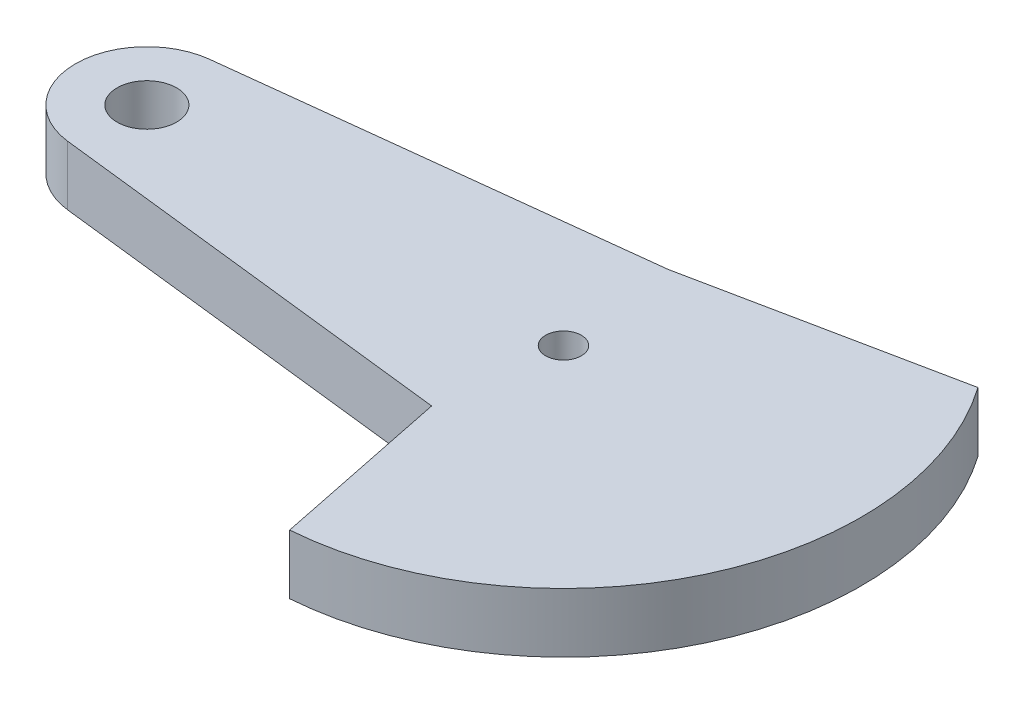
ISO-10303-21;
HEADER;
FILE_DESCRIPTION(('STEP AP214'),'2;1');
FILE_NAME('part.step','',(''),(''),'','','');
FILE_SCHEMA(('AUTOMOTIVE_DESIGN { 1 0 10303 214 1 1 1 1 }'));
ENDSEC;
DATA;
#1=APPLICATION_CONTEXT('core data for automotive mechanical design processes');
#2=APPLICATION_PROTOCOL_DEFINITION('international standard','automotive_design',2000,#1);
#3=PRODUCT_CONTEXT('',#1,'mechanical');
#4=PRODUCT('Part','Part','',(#3));
#5=PRODUCT_RELATED_PRODUCT_CATEGORY('part','',(#4));
#6=PRODUCT_DEFINITION_FORMATION('','',#4);
#7=PRODUCT_DEFINITION_CONTEXT('part definition',#1,'design');
#8=PRODUCT_DEFINITION('design','',#6,#7);
#9=PRODUCT_DEFINITION_SHAPE('','',#8);
#10=(LENGTH_UNIT() NAMED_UNIT(*) SI_UNIT(.MILLI.,.METRE.));
#11=(NAMED_UNIT(*) PLANE_ANGLE_UNIT() SI_UNIT($,.RADIAN.));
#12=(NAMED_UNIT(*) SI_UNIT($,.STERADIAN.) SOLID_ANGLE_UNIT());
#13=UNCERTAINTY_MEASURE_WITH_UNIT(LENGTH_MEASURE(1.E-05),#10,'distance_accuracy_value','');
#14=(GEOMETRIC_REPRESENTATION_CONTEXT(3) GLOBAL_UNCERTAINTY_ASSIGNED_CONTEXT((#13)) GLOBAL_UNIT_ASSIGNED_CONTEXT((#10,
#11,#12)) REPRESENTATION_CONTEXT('',''));
#15=CARTESIAN_POINT('',(0.,0.,0.));
#16=DIRECTION('',(0.,0.,1.));
#17=DIRECTION('',(1.,0.,0.));
#18=AXIS2_PLACEMENT_3D('',#15,#16,#17);
#19=CARTESIAN_POINT('',(10.,-43.8,-9.99999999999999));
#20=DIRECTION('',(0.,-1.,0.));
#21=DIRECTION('',(0.,0.,-1.));
#22=AXIS2_PLACEMENT_3D('',#19,#20,#21);
#23=PLANE('',#22);
#24=CARTESIAN_POINT('',(10.,-43.8,-9.99999999999999));
#25=DIRECTION('',(0.,-1.,0.));
#26=DIRECTION('',(0.,0.,-1.));
#27=AXIS2_PLACEMENT_3D('',#24,#25,#26);
#28=CIRCLE('',#27,1.5);
#29=CARTESIAN_POINT('',(10.,-43.8,-11.5));
#30=VERTEX_POINT('',#29);
#31=EDGE_CURVE('E124',#30,#30,#28,.T.);
#32=ORIENTED_EDGE('',*,*,#31,.F.);
#33=EDGE_LOOP('',(#32));
#34=FACE_BOUND('',#33,.T.);
#35=DIRECTION('',(-0.200435514240337,0.,-0.979706897307155));
#36=VECTOR('',#35,1.);
#37=CARTESIAN_POINT('',(8.85714285714286,-43.8,-0.0655207710207571));
#38=LINE('',#37,#36);
#39=CARTESIAN_POINT('',(11.9241838076419,-43.8,14.9258403403859));
#40=VERTEX_POINT('',#39);
#41=CARTESIAN_POINT('',(8.85714285714286,-43.8,-0.0655207710207571));
#42=VERTEX_POINT('',#41);
#43=EDGE_CURVE('E131',#40,#42,#38,.T.);
#44=ORIENTED_EDGE('',*,*,#43,.T.);
#45=DIRECTION('',(-0.993447922897926,0.,-0.114285714285714));
#46=VECTOR('',#45,1.);
#47=CARTESIAN_POINT('',(8.85714285714286,-43.8,-0.0655207710207571));
#48=LINE('',#47,#46);
#49=CARTESIAN_POINT('',(-25.6857142857142,-43.8,-4.03931246261245));
#50=VERTEX_POINT('',#49);
#51=EDGE_CURVE('E89',#42,#50,#48,.T.);
#52=ORIENTED_EDGE('',*,*,#51,.T.);
#53=CARTESIAN_POINT('',(-24.9999999999999,-43.8,-10.));
#54=DIRECTION('',(0.,-1.,0.));
#55=DIRECTION('',(0.,0.,-1.));
#56=AXIS2_PLACEMENT_3D('',#53,#54,#55);
#57=CIRCLE('',#56,6.);
#58=CARTESIAN_POINT('',(-25.6857142857142,-43.8,-15.9606875373876));
#59=VERTEX_POINT('',#58);
#60=EDGE_CURVE('E102',#50,#59,#57,.T.);
#61=ORIENTED_EDGE('',*,*,#60,.T.);
#62=DIRECTION('',(0.993447922897926,0.,-0.114285714285715));
#63=VECTOR('',#62,1.);
#64=CARTESIAN_POINT('',(-25.6857142857142,-43.8,-15.9606875373876));
#65=LINE('',#64,#63);
#66=CARTESIAN_POINT('',(8.85714285714286,-43.8,-19.9344792289793));
#67=VERTEX_POINT('',#66);
#68=EDGE_CURVE('E96',#59,#67,#65,.T.);
#69=ORIENTED_EDGE('',*,*,#68,.T.);
#70=DIRECTION('',(0.979706897307154,0.,-0.200435514240341));
#71=VECTOR('',#70,1.);
#72=CARTESIAN_POINT('',(8.85714285714286,-43.8,-19.9344792289793));
#73=LINE('',#72,#71);
#74=CARTESIAN_POINT('',(30.4674109628781,-43.8,-24.3556639859206));
#75=VERTEX_POINT('',#74);
#76=EDGE_CURVE('E100',#67,#75,#73,.T.);
#77=ORIENTED_EDGE('',*,*,#76,.T.);
#78=CARTESIAN_POINT('',(10.,-43.8,-9.99999999999999));
#79=DIRECTION('',(0.,-1.,0.));
#80=DIRECTION('',(0.,0.,-1.));
#81=AXIS2_PLACEMENT_3D('',#78,#79,#80);
#82=CIRCLE('',#81,25.);
#83=EDGE_CURVE('E52',#75,#40,#82,.T.);
#84=ORIENTED_EDGE('',*,*,#83,.T.);
#85=EDGE_LOOP('',(#44,#52,#61,#69,#77,#84));
#86=FACE_BOUND('',#85,.T.);
#87=CARTESIAN_POINT('',(-24.9999999999999,-43.8,-10.));
#88=DIRECTION('',(0.,-1.,0.));
#89=DIRECTION('',(0.,0.,-1.));
#90=AXIS2_PLACEMENT_3D('',#87,#88,#89);
#91=CIRCLE('',#90,2.5);
#92=CARTESIAN_POINT('',(-24.9999999999999,-43.8,-12.5));
#93=VERTEX_POINT('',#92);
#94=EDGE_CURVE('E173',#93,#93,#91,.T.);
#95=ORIENTED_EDGE('',*,*,#94,.F.);
#96=EDGE_LOOP('',(#95));
#97=FACE_BOUND('',#96,.T.);
#98=ADVANCED_FACE('F35',(#34,#86,#97),#23,.T.);
#99=CARTESIAN_POINT('',(10.,-38.8,-9.99999999999999));
#100=DIRECTION('',(0.,-1.,0.));
#101=DIRECTION('',(0.,0.,-1.));
#102=AXIS2_PLACEMENT_3D('',#99,#100,#101);
#103=PLANE('',#102);
#104=DIRECTION('',(-0.200435514240337,0.,-0.979706897307155));
#105=VECTOR('',#104,1.);
#106=CARTESIAN_POINT('',(8.85714285714286,-38.8,-0.0655207710207571));
#107=LINE('',#106,#105);
#108=CARTESIAN_POINT('',(11.9241838076419,-38.8,14.9258403403859));
#109=VERTEX_POINT('',#108);
#110=CARTESIAN_POINT('',(8.85714285714286,-38.8,-0.0655207710207571));
#111=VERTEX_POINT('',#110);
#112=EDGE_CURVE('E120',#109,#111,#107,.T.);
#113=ORIENTED_EDGE('',*,*,#112,.F.);
#114=CARTESIAN_POINT('',(10.,-38.8,-9.99999999999999));
#115=DIRECTION('',(0.,-1.,0.));
#116=DIRECTION('',(0.,0.,-1.));
#117=AXIS2_PLACEMENT_3D('',#114,#115,#116);
#118=CIRCLE('',#117,25.);
#119=CARTESIAN_POINT('',(30.4674109628781,-38.8,-24.3556639859206));
#120=VERTEX_POINT('',#119);
#121=EDGE_CURVE('E81',#120,#109,#118,.T.);
#122=ORIENTED_EDGE('',*,*,#121,.F.);
#123=DIRECTION('',(0.979706897307154,0.,-0.200435514240341));
#124=VECTOR('',#123,1.);
#125=CARTESIAN_POINT('',(8.85714285714286,-38.8,-19.9344792289793));
#126=LINE('',#125,#124);
#127=CARTESIAN_POINT('',(8.85714285714286,-38.8,-19.9344792289793));
#128=VERTEX_POINT('',#127);
#129=EDGE_CURVE('E75',#128,#120,#126,.T.);
#130=ORIENTED_EDGE('',*,*,#129,.F.);
#131=DIRECTION('',(0.993447922897926,0.,-0.114285714285715));
#132=VECTOR('',#131,1.);
#133=CARTESIAN_POINT('',(-25.6857142857142,-38.8,-15.9606875373876));
#134=LINE('',#133,#132);
#135=CARTESIAN_POINT('',(-25.6857142857142,-38.8,-15.9606875373876));
#136=VERTEX_POINT('',#135);
#137=EDGE_CURVE('E110',#136,#128,#134,.T.);
#138=ORIENTED_EDGE('',*,*,#137,.F.);
#139=CARTESIAN_POINT('',(-24.9999999999999,-38.8,-10.));
#140=DIRECTION('',(0.,-1.,0.));
#141=DIRECTION('',(0.,0.,-1.));
#142=AXIS2_PLACEMENT_3D('',#139,#140,#141);
#143=CIRCLE('',#142,6.);
#144=CARTESIAN_POINT('',(-25.6857142857142,-38.8,-4.03931246261245));
#145=VERTEX_POINT('',#144);
#146=EDGE_CURVE('E126',#145,#136,#143,.T.);
#147=ORIENTED_EDGE('',*,*,#146,.F.);
#148=DIRECTION('',(-0.993447922897926,0.,-0.114285714285714));
#149=VECTOR('',#148,1.);
#150=CARTESIAN_POINT('',(8.85714285714286,-38.8,-0.0655207710207571));
#151=LINE('',#150,#149);
#152=EDGE_CURVE('E123',#111,#145,#151,.T.);
#153=ORIENTED_EDGE('',*,*,#152,.F.);
#154=EDGE_LOOP('',(#113,#122,#130,#138,#147,#153));
#155=FACE_BOUND('',#154,.T.);
#156=CARTESIAN_POINT('',(10.,-38.8,-9.99999999999999));
#157=DIRECTION('',(0.,-1.,0.));
#158=DIRECTION('',(0.,0.,-1.));
#159=AXIS2_PLACEMENT_3D('',#156,#157,#158);
#160=CIRCLE('',#159,1.5);
#161=CARTESIAN_POINT('',(10.,-38.8,-11.5));
#162=VERTEX_POINT('',#161);
#163=EDGE_CURVE('E179',#162,#162,#160,.T.);
#164=ORIENTED_EDGE('',*,*,#163,.T.);
#165=EDGE_LOOP('',(#164));
#166=FACE_BOUND('',#165,.T.);
#167=CARTESIAN_POINT('',(-24.9999999999999,-38.8,-10.));
#168=DIRECTION('',(0.,-1.,0.));
#169=DIRECTION('',(0.,0.,-1.));
#170=AXIS2_PLACEMENT_3D('',#167,#168,#169);
#171=CIRCLE('',#170,2.5);
#172=CARTESIAN_POINT('',(-24.9999999999999,-38.8,-12.5));
#173=VERTEX_POINT('',#172);
#174=EDGE_CURVE('E176',#173,#173,#171,.T.);
#175=ORIENTED_EDGE('',*,*,#174,.T.);
#176=EDGE_LOOP('',(#175));
#177=FACE_BOUND('',#176,.T.);
#178=ADVANCED_FACE('F140',(#155,#166,#177),#103,.F.);
#179=CARTESIAN_POINT('',(8.85714285714286,-43.8,-0.0655207710207571));
#180=DIRECTION('',(0.979706897307155,0.,-0.200435514240337));
#181=DIRECTION('',(-0.200435514240337,0.,-0.979706897307155));
#182=AXIS2_PLACEMENT_3D('',#179,#180,#181);
#183=PLANE('',#182);
#184=ORIENTED_EDGE('',*,*,#112,.T.);
#185=DIRECTION('',(0.,1.,0.));
#186=VECTOR('',#185,1.);
#187=CARTESIAN_POINT('',(8.85714285714286,-43.8,-0.0655207710207571));
#188=LINE('',#187,#186);
#189=EDGE_CURVE('E11',#42,#111,#188,.T.);
#190=ORIENTED_EDGE('',*,*,#189,.F.);
#191=ORIENTED_EDGE('',*,*,#43,.F.);
#192=DIRECTION('',(0.,1.,0.));
#193=VECTOR('',#192,1.);
#194=CARTESIAN_POINT('',(11.9241838076419,-43.8,14.9258403403859));
#195=LINE('',#194,#193);
#196=EDGE_CURVE('E116',#40,#109,#195,.T.);
#197=ORIENTED_EDGE('',*,*,#196,.T.);
#198=EDGE_LOOP('',(#184,#190,#191,#197));
#199=FACE_BOUND('',#198,.T.);
#200=ADVANCED_FACE('F37',(#199),#183,.F.);
#201=CARTESIAN_POINT('',(8.85714285714286,-43.8,-0.0655207710207571));
#202=DIRECTION('',(0.114285714285714,0.,-0.993447922897926));
#203=DIRECTION('',(-0.993447922897926,0.,-0.114285714285714));
#204=AXIS2_PLACEMENT_3D('',#201,#202,#203);
#205=PLANE('',#204);
#206=ORIENTED_EDGE('',*,*,#152,.T.);
#207=DIRECTION('',(0.,1.,0.));
#208=VECTOR('',#207,1.);
#209=CARTESIAN_POINT('',(-25.6857142857142,-43.8,-4.03931246261245));
#210=LINE('',#209,#208);
#211=EDGE_CURVE('E44',#50,#145,#210,.T.);
#212=ORIENTED_EDGE('',*,*,#211,.F.);
#213=ORIENTED_EDGE('',*,*,#51,.F.);
#214=ORIENTED_EDGE('',*,*,#189,.T.);
#215=EDGE_LOOP('',(#206,#212,#213,#214));
#216=FACE_BOUND('',#215,.T.);
#217=ADVANCED_FACE('F220',(#216),#205,.F.);
#218=CARTESIAN_POINT('',(-24.9999999999999,-43.8,-10.));
#219=DIRECTION('',(0.,1.,0.));
#220=DIRECTION('',(0.,0.,1.));
#221=AXIS2_PLACEMENT_3D('',#218,#219,#220);
#222=CYLINDRICAL_SURFACE('',#221,6.);
#223=ORIENTED_EDGE('',*,*,#146,.T.);
#224=DIRECTION('',(0.,1.,0.));
#225=VECTOR('',#224,1.);
#226=CARTESIAN_POINT('',(-25.6857142857142,-43.8,-15.9606875373876));
#227=LINE('',#226,#225);
#228=EDGE_CURVE('E111',#59,#136,#227,.T.);
#229=ORIENTED_EDGE('',*,*,#228,.F.);
#230=ORIENTED_EDGE('',*,*,#60,.F.);
#231=ORIENTED_EDGE('',*,*,#211,.T.);
#232=EDGE_LOOP('',(#223,#229,#230,#231));
#233=FACE_BOUND('',#232,.T.);
#234=ADVANCED_FACE('F137',(#233),#222,.T.);
#235=CARTESIAN_POINT('',(-25.6857142857142,-43.8,-15.9606875373876));
#236=DIRECTION('',(0.114285714285715,0.,0.993447922897926));
#237=DIRECTION('',(0.993447922897926,0.,-0.114285714285715));
#238=AXIS2_PLACEMENT_3D('',#235,#236,#237);
#239=PLANE('',#238);
#240=ORIENTED_EDGE('',*,*,#137,.T.);
#241=DIRECTION('',(0.,1.,0.));
#242=VECTOR('',#241,1.);
#243=CARTESIAN_POINT('',(8.85714285714286,-43.8,-19.9344792289793));
#244=LINE('',#243,#242);
#245=EDGE_CURVE('E107',#67,#128,#244,.T.);
#246=ORIENTED_EDGE('',*,*,#245,.F.);
#247=ORIENTED_EDGE('',*,*,#68,.F.);
#248=ORIENTED_EDGE('',*,*,#228,.T.);
#249=EDGE_LOOP('',(#240,#246,#247,#248));
#250=FACE_BOUND('',#249,.T.);
#251=ADVANCED_FACE('F108',(#250),#239,.F.);
#252=CARTESIAN_POINT('',(8.85714285714286,-43.8,-19.9344792289793));
#253=DIRECTION('',(0.200435514240341,0.,0.979706897307154));
#254=DIRECTION('',(0.979706897307154,0.,-0.200435514240341));
#255=AXIS2_PLACEMENT_3D('',#252,#253,#254);
#256=PLANE('',#255);
#257=ORIENTED_EDGE('',*,*,#129,.T.);
#258=DIRECTION('',(0.,1.,0.));
#259=VECTOR('',#258,1.);
#260=CARTESIAN_POINT('',(30.4674109628781,-43.8,-24.3556639859206));
#261=LINE('',#260,#259);
#262=EDGE_CURVE('E112',#75,#120,#261,.T.);
#263=ORIENTED_EDGE('',*,*,#262,.F.);
#264=ORIENTED_EDGE('',*,*,#76,.F.);
#265=ORIENTED_EDGE('',*,*,#245,.T.);
#266=EDGE_LOOP('',(#257,#263,#264,#265));
#267=FACE_BOUND('',#266,.T.);
#268=ADVANCED_FACE('F114',(#267),#256,.F.);
#269=CARTESIAN_POINT('',(10.,-43.8,-9.99999999999999));
#270=DIRECTION('',(0.,1.,0.));
#271=DIRECTION('',(0.,0.,1.));
#272=AXIS2_PLACEMENT_3D('',#269,#270,#271);
#273=CYLINDRICAL_SURFACE('',#272,25.);
#274=ORIENTED_EDGE('',*,*,#121,.T.);
#275=ORIENTED_EDGE('',*,*,#196,.F.);
#276=ORIENTED_EDGE('',*,*,#83,.F.);
#277=ORIENTED_EDGE('',*,*,#262,.T.);
#278=EDGE_LOOP('',(#274,#275,#276,#277));
#279=FACE_BOUND('',#278,.T.);
#280=ADVANCED_FACE('F145',(#279),#273,.T.);
#281=CARTESIAN_POINT('',(10.,-43.8,-9.99999999999999));
#282=DIRECTION('',(0.,1.,0.));
#283=DIRECTION('',(0.,0.,1.));
#284=AXIS2_PLACEMENT_3D('',#281,#282,#283);
#285=CYLINDRICAL_SURFACE('',#284,1.5);
#286=ORIENTED_EDGE('',*,*,#31,.T.);
#287=EDGE_LOOP('',(#286));
#288=FACE_BOUND('',#287,.T.);
#289=ORIENTED_EDGE('',*,*,#163,.F.);
#290=EDGE_LOOP('',(#289));
#291=FACE_BOUND('',#290,.T.);
#292=ADVANCED_FACE('F147',(#288,#291),#285,.F.);
#293=CARTESIAN_POINT('',(-24.9999999999999,-43.8,-10.));
#294=DIRECTION('',(0.,1.,0.));
#295=DIRECTION('',(0.,0.,1.));
#296=AXIS2_PLACEMENT_3D('',#293,#294,#295);
#297=CYLINDRICAL_SURFACE('',#296,2.5);
#298=ORIENTED_EDGE('',*,*,#94,.T.);
#299=EDGE_LOOP('',(#298));
#300=FACE_BOUND('',#299,.T.);
#301=ORIENTED_EDGE('',*,*,#174,.F.);
#302=EDGE_LOOP('',(#301));
#303=FACE_BOUND('',#302,.T.);
#304=ADVANCED_FACE('F153',(#300,#303),#297,.F.);
#305=CLOSED_SHELL('',(#98,#178,#200,#217,#234,#251,#268,#280,#292,#304));
#306=MANIFOLD_SOLID_BREP('B2',#305);
#307=ADVANCED_BREP_SHAPE_REPRESENTATION('',(#18,#306),#14);
#308=SHAPE_DEFINITION_REPRESENTATION(#9,#307);
ENDSEC;
END-ISO-10303-21;
